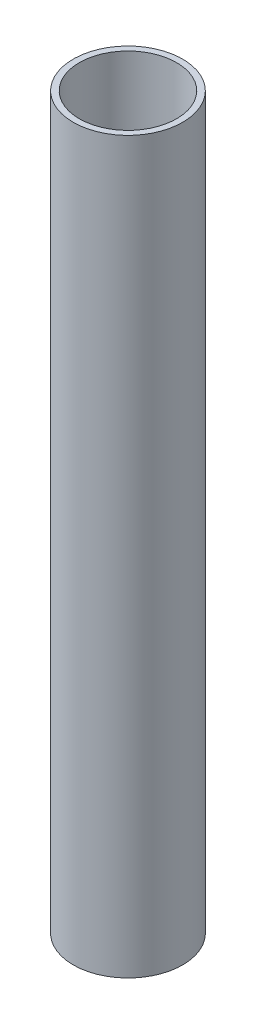
ISO-10303-21;
HEADER;
FILE_DESCRIPTION(('STEP AP214'),'2;1');
FILE_NAME('part.step','',(''),(''),'','','');
FILE_SCHEMA(('AUTOMOTIVE_DESIGN { 1 0 10303 214 1 1 1 1 }'));
ENDSEC;
DATA;
#1=APPLICATION_CONTEXT('core data for automotive mechanical design processes');
#2=APPLICATION_PROTOCOL_DEFINITION('international standard','automotive_design',2000,#1);
#3=PRODUCT_CONTEXT('',#1,'mechanical');
#4=PRODUCT('Part','Part','',(#3));
#5=PRODUCT_RELATED_PRODUCT_CATEGORY('part','',(#4));
#6=PRODUCT_DEFINITION_FORMATION('','',#4);
#7=PRODUCT_DEFINITION_CONTEXT('part definition',#1,'design');
#8=PRODUCT_DEFINITION('design','',#6,#7);
#9=PRODUCT_DEFINITION_SHAPE('','',#8);
#10=(LENGTH_UNIT() NAMED_UNIT(*) SI_UNIT(.MILLI.,.METRE.));
#11=(NAMED_UNIT(*) PLANE_ANGLE_UNIT() SI_UNIT($,.RADIAN.));
#12=(NAMED_UNIT(*) SI_UNIT($,.STERADIAN.) SOLID_ANGLE_UNIT());
#13=UNCERTAINTY_MEASURE_WITH_UNIT(LENGTH_MEASURE(1.E-05),#10,'distance_accuracy_value','');
#14=(GEOMETRIC_REPRESENTATION_CONTEXT(3) GLOBAL_UNCERTAINTY_ASSIGNED_CONTEXT((#13)) GLOBAL_UNIT_ASSIGNED_CONTEXT((#10,
#11,#12)) REPRESENTATION_CONTEXT('',''));
#15=CARTESIAN_POINT('',(0.,0.,0.));
#16=DIRECTION('',(0.,0.,1.));
#17=DIRECTION('',(1.,0.,0.));
#18=AXIS2_PLACEMENT_3D('',#15,#16,#17);
#19=CARTESIAN_POINT('',(0.,600.,0.));
#20=DIRECTION('',(0.,1.,0.));
#21=DIRECTION('',(0.,0.,1.));
#22=AXIS2_PLACEMENT_3D('',#19,#20,#21);
#23=PLANE('',#22);
#24=CARTESIAN_POINT('',(0.,600.,0.));
#25=DIRECTION('',(0.,1.,0.));
#26=DIRECTION('',(0.,0.,1.));
#27=AXIS2_PLACEMENT_3D('',#24,#25,#26);
#28=CIRCLE('',#27,45.);
#29=CARTESIAN_POINT('',(0.,600.,45.));
#30=VERTEX_POINT('',#29);
#31=EDGE_CURVE('E10',#30,#30,#28,.T.);
#32=ORIENTED_EDGE('',*,*,#31,.T.);
#33=EDGE_LOOP('',(#32));
#34=FACE_BOUND('',#33,.T.);
#35=CARTESIAN_POINT('',(0.,600.,0.));
#36=DIRECTION('',(0.,1.,0.));
#37=DIRECTION('',(0.,0.,1.));
#38=AXIS2_PLACEMENT_3D('',#35,#36,#37);
#39=CIRCLE('',#38,40.);
#40=CARTESIAN_POINT('',(0.,600.,40.));
#41=VERTEX_POINT('',#40);
#42=EDGE_CURVE('E56',#41,#41,#39,.T.);
#43=ORIENTED_EDGE('',*,*,#42,.F.);
#44=EDGE_LOOP('',(#43));
#45=FACE_BOUND('',#44,.T.);
#46=ADVANCED_FACE('F43',(#34,#45),#23,.T.);
#47=CARTESIAN_POINT('',(0.,0.,0.));
#48=DIRECTION('',(0.,1.,0.));
#49=DIRECTION('',(0.,0.,1.));
#50=AXIS2_PLACEMENT_3D('',#47,#48,#49);
#51=PLANE('',#50);
#52=CARTESIAN_POINT('',(0.,0.,0.));
#53=DIRECTION('',(0.,1.,0.));
#54=DIRECTION('',(0.,0.,1.));
#55=AXIS2_PLACEMENT_3D('',#52,#53,#54);
#56=CIRCLE('',#55,45.);
#57=CARTESIAN_POINT('',(0.,0.,45.));
#58=VERTEX_POINT('',#57);
#59=EDGE_CURVE('E47',#58,#58,#56,.T.);
#60=ORIENTED_EDGE('',*,*,#59,.F.);
#61=EDGE_LOOP('',(#60));
#62=FACE_BOUND('',#61,.T.);
#63=CARTESIAN_POINT('',(0.,0.,0.));
#64=DIRECTION('',(0.,1.,0.));
#65=DIRECTION('',(0.,0.,1.));
#66=AXIS2_PLACEMENT_3D('',#63,#64,#65);
#67=CIRCLE('',#66,40.);
#68=CARTESIAN_POINT('',(0.,0.,40.));
#69=VERTEX_POINT('',#68);
#70=EDGE_CURVE('E58',#69,#69,#67,.T.);
#71=ORIENTED_EDGE('',*,*,#70,.T.);
#72=EDGE_LOOP('',(#71));
#73=FACE_BOUND('',#72,.T.);
#74=ADVANCED_FACE('F70',(#62,#73),#51,.F.);
#75=CARTESIAN_POINT('',(0.,600.,0.));
#76=DIRECTION('',(0.,-1.,0.));
#77=DIRECTION('',(0.,0.,-1.));
#78=AXIS2_PLACEMENT_3D('',#75,#76,#77);
#79=CYLINDRICAL_SURFACE('',#78,45.);
#80=ORIENTED_EDGE('',*,*,#31,.F.);
#81=EDGE_LOOP('',(#80));
#82=FACE_BOUND('',#81,.T.);
#83=ORIENTED_EDGE('',*,*,#59,.T.);
#84=EDGE_LOOP('',(#83));
#85=FACE_BOUND('',#84,.T.);
#86=ADVANCED_FACE('F45',(#82,#85),#79,.T.);
#87=CARTESIAN_POINT('',(0.,600.,0.));
#88=DIRECTION('',(0.,-1.,0.));
#89=DIRECTION('',(0.,0.,-1.));
#90=AXIS2_PLACEMENT_3D('',#87,#88,#89);
#91=CYLINDRICAL_SURFACE('',#90,40.);
#92=ORIENTED_EDGE('',*,*,#42,.T.);
#93=EDGE_LOOP('',(#92));
#94=FACE_BOUND('',#93,.T.);
#95=ORIENTED_EDGE('',*,*,#70,.F.);
#96=EDGE_LOOP('',(#95));
#97=FACE_BOUND('',#96,.T.);
#98=ADVANCED_FACE('F66',(#94,#97),#91,.F.);
#99=CLOSED_SHELL('',(#46,#74,#86,#98));
#100=MANIFOLD_SOLID_BREP('B2',#99);
#101=ADVANCED_BREP_SHAPE_REPRESENTATION('',(#18,#100),#14);
#102=SHAPE_DEFINITION_REPRESENTATION(#9,#101);
ENDSEC;
END-ISO-10303-21;
